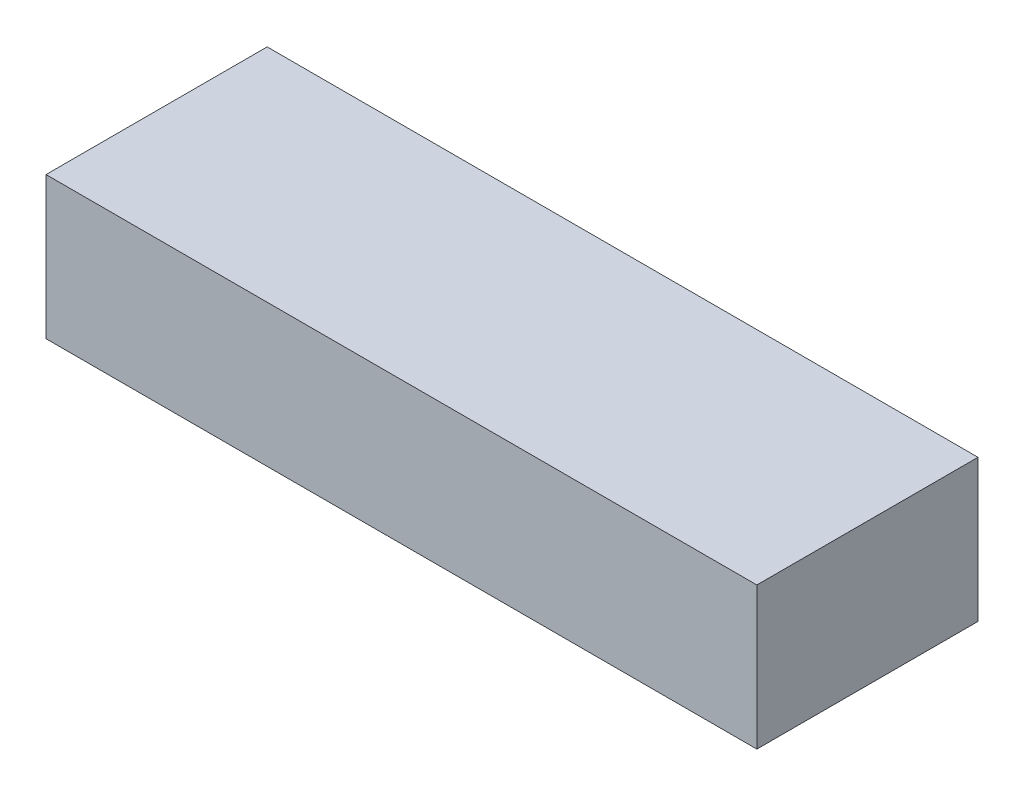
ISO-10303-21;
HEADER;
FILE_DESCRIPTION(('STEP AP214'),'2;1');
FILE_NAME('part.step','',(''),(''),'','','');
FILE_SCHEMA(('AUTOMOTIVE_DESIGN { 1 0 10303 214 1 1 1 1 }'));
ENDSEC;
DATA;
#1=APPLICATION_CONTEXT('core data for automotive mechanical design processes');
#2=APPLICATION_PROTOCOL_DEFINITION('international standard','automotive_design',2000,#1);
#3=PRODUCT_CONTEXT('',#1,'mechanical');
#4=PRODUCT('Part','Part','',(#3));
#5=PRODUCT_RELATED_PRODUCT_CATEGORY('part','',(#4));
#6=PRODUCT_DEFINITION_FORMATION('','',#4);
#7=PRODUCT_DEFINITION_CONTEXT('part definition',#1,'design');
#8=PRODUCT_DEFINITION('design','',#6,#7);
#9=PRODUCT_DEFINITION_SHAPE('','',#8);
#10=(LENGTH_UNIT() NAMED_UNIT(*) SI_UNIT(.MILLI.,.METRE.));
#11=(NAMED_UNIT(*) PLANE_ANGLE_UNIT() SI_UNIT($,.RADIAN.));
#12=(NAMED_UNIT(*) SI_UNIT($,.STERADIAN.) SOLID_ANGLE_UNIT());
#13=UNCERTAINTY_MEASURE_WITH_UNIT(LENGTH_MEASURE(1.E-05),#10,'distance_accuracy_value','');
#14=(GEOMETRIC_REPRESENTATION_CONTEXT(3) GLOBAL_UNCERTAINTY_ASSIGNED_CONTEXT((#13)) GLOBAL_UNIT_ASSIGNED_CONTEXT((#10,
#11,#12)) REPRESENTATION_CONTEXT('',''));
#15=CARTESIAN_POINT('',(0.,0.,0.));
#16=DIRECTION('',(0.,0.,1.));
#17=DIRECTION('',(1.,0.,0.));
#18=AXIS2_PLACEMENT_3D('',#15,#16,#17);
#19=CARTESIAN_POINT('',(0.,27.,0.));
#20=DIRECTION('',(1.,0.,0.));
#21=DIRECTION('',(0.,0.,-1.));
#22=AXIS2_PLACEMENT_3D('',#19,#20,#21);
#23=PLANE('',#22);
#24=DIRECTION('',(0.,0.,1.));
#25=VECTOR('',#24,1.);
#26=CARTESIAN_POINT('',(0.,0.,0.));
#27=LINE('',#26,#25);
#28=CARTESIAN_POINT('',(0.,0.,-42.));
#29=VERTEX_POINT('',#28);
#30=CARTESIAN_POINT('',(0.,0.,0.));
#31=VERTEX_POINT('',#30);
#32=EDGE_CURVE('E103',#29,#31,#27,.T.);
#33=ORIENTED_EDGE('',*,*,#32,.T.);
#34=DIRECTION('',(0.,-1.,0.));
#35=VECTOR('',#34,1.);
#36=CARTESIAN_POINT('',(0.,27.,0.));
#37=LINE('',#36,#35);
#38=CARTESIAN_POINT('',(0.,27.,0.));
#39=VERTEX_POINT('',#38);
#40=EDGE_CURVE('E11',#39,#31,#37,.T.);
#41=ORIENTED_EDGE('',*,*,#40,.F.);
#42=DIRECTION('',(0.,0.,1.));
#43=VECTOR('',#42,1.);
#44=CARTESIAN_POINT('',(0.,27.,0.));
#45=LINE('',#44,#43);
#46=CARTESIAN_POINT('',(0.,27.,-42.));
#47=VERTEX_POINT('',#46);
#48=EDGE_CURVE('E91',#47,#39,#45,.T.);
#49=ORIENTED_EDGE('',*,*,#48,.F.);
#50=DIRECTION('',(0.,-1.,0.));
#51=VECTOR('',#50,1.);
#52=CARTESIAN_POINT('',(0.,27.,-42.));
#53=LINE('',#52,#51);
#54=EDGE_CURVE('E99',#47,#29,#53,.T.);
#55=ORIENTED_EDGE('',*,*,#54,.T.);
#56=EDGE_LOOP('',(#33,#41,#49,#55));
#57=FACE_BOUND('',#56,.T.);
#58=ADVANCED_FACE('F40',(#57),#23,.F.);
#59=CARTESIAN_POINT('',(0.,27.,0.));
#60=DIRECTION('',(0.,0.,-1.));
#61=DIRECTION('',(-1.,0.,0.));
#62=AXIS2_PLACEMENT_3D('',#59,#60,#61);
#63=PLANE('',#62);
#64=DIRECTION('',(1.,0.,0.));
#65=VECTOR('',#64,1.);
#66=CARTESIAN_POINT('',(0.,0.,0.));
#67=LINE('',#66,#65);
#68=CARTESIAN_POINT('',(135.,0.,0.));
#69=VERTEX_POINT('',#68);
#70=EDGE_CURVE('E95',#31,#69,#67,.T.);
#71=ORIENTED_EDGE('',*,*,#70,.T.);
#72=DIRECTION('',(0.,-1.,0.));
#73=VECTOR('',#72,1.);
#74=CARTESIAN_POINT('',(135.,27.,0.));
#75=LINE('',#74,#73);
#76=CARTESIAN_POINT('',(135.,27.,0.));
#77=VERTEX_POINT('',#76);
#78=EDGE_CURVE('E48',#77,#69,#75,.T.);
#79=ORIENTED_EDGE('',*,*,#78,.F.);
#80=DIRECTION('',(1.,0.,0.));
#81=VECTOR('',#80,1.);
#82=CARTESIAN_POINT('',(0.,27.,0.));
#83=LINE('',#82,#81);
#84=EDGE_CURVE('E86',#39,#77,#83,.T.);
#85=ORIENTED_EDGE('',*,*,#84,.F.);
#86=ORIENTED_EDGE('',*,*,#40,.T.);
#87=EDGE_LOOP('',(#71,#79,#85,#86));
#88=FACE_BOUND('',#87,.T.);
#89=ADVANCED_FACE('F94',(#88),#63,.F.);
#90=CARTESIAN_POINT('',(135.,27.,0.));
#91=DIRECTION('',(-1.,0.,0.));
#92=DIRECTION('',(0.,0.,1.));
#93=AXIS2_PLACEMENT_3D('',#90,#91,#92);
#94=PLANE('',#93);
#95=DIRECTION('',(0.,0.,-1.));
#96=VECTOR('',#95,1.);
#97=CARTESIAN_POINT('',(135.,0.,0.));
#98=LINE('',#97,#96);
#99=CARTESIAN_POINT('',(135.,0.,-42.));
#100=VERTEX_POINT('',#99);
#101=EDGE_CURVE('E73',#69,#100,#98,.T.);
#102=ORIENTED_EDGE('',*,*,#101,.T.);
#103=DIRECTION('',(0.,-1.,0.));
#104=VECTOR('',#103,1.);
#105=CARTESIAN_POINT('',(135.,27.,-42.));
#106=LINE('',#105,#104);
#107=CARTESIAN_POINT('',(135.,27.,-42.));
#108=VERTEX_POINT('',#107);
#109=EDGE_CURVE('E96',#108,#100,#106,.T.);
#110=ORIENTED_EDGE('',*,*,#109,.F.);
#111=DIRECTION('',(0.,0.,-1.));
#112=VECTOR('',#111,1.);
#113=CARTESIAN_POINT('',(135.,27.,0.));
#114=LINE('',#113,#112);
#115=EDGE_CURVE('E89',#77,#108,#114,.T.);
#116=ORIENTED_EDGE('',*,*,#115,.F.);
#117=ORIENTED_EDGE('',*,*,#78,.T.);
#118=EDGE_LOOP('',(#102,#110,#116,#117));
#119=FACE_BOUND('',#118,.T.);
#120=ADVANCED_FACE('F97',(#119),#94,.F.);
#121=CARTESIAN_POINT('',(0.,27.,-42.));
#122=DIRECTION('',(0.,0.,1.));
#123=DIRECTION('',(1.,0.,0.));
#124=AXIS2_PLACEMENT_3D('',#121,#122,#123);
#125=PLANE('',#124);
#126=DIRECTION('',(-1.,0.,0.));
#127=VECTOR('',#126,1.);
#128=CARTESIAN_POINT('',(0.,0.,-42.));
#129=LINE('',#128,#127);
#130=EDGE_CURVE('E79',#100,#29,#129,.T.);
#131=ORIENTED_EDGE('',*,*,#130,.T.);
#132=ORIENTED_EDGE('',*,*,#54,.F.);
#133=DIRECTION('',(-1.,0.,0.));
#134=VECTOR('',#133,1.);
#135=CARTESIAN_POINT('',(0.,27.,-42.));
#136=LINE('',#135,#134);
#137=EDGE_CURVE('E56',#108,#47,#136,.T.);
#138=ORIENTED_EDGE('',*,*,#137,.F.);
#139=ORIENTED_EDGE('',*,*,#109,.T.);
#140=EDGE_LOOP('',(#131,#132,#138,#139));
#141=FACE_BOUND('',#140,.T.);
#142=ADVANCED_FACE('F110',(#141),#125,.F.);
#143=CARTESIAN_POINT('',(0.,27.,0.));
#144=DIRECTION('',(0.,-1.,0.));
#145=DIRECTION('',(0.,0.,-1.));
#146=AXIS2_PLACEMENT_3D('',#143,#144,#145);
#147=PLANE('',#146);
#148=ORIENTED_EDGE('',*,*,#48,.T.);
#149=ORIENTED_EDGE('',*,*,#84,.T.);
#150=ORIENTED_EDGE('',*,*,#115,.T.);
#151=ORIENTED_EDGE('',*,*,#137,.T.);
#152=EDGE_LOOP('',(#148,#149,#150,#151));
#153=FACE_BOUND('',#152,.T.);
#154=ADVANCED_FACE('F87',(#153),#147,.F.);
#155=CARTESIAN_POINT('',(0.,0.,0.));
#156=DIRECTION('',(0.,-1.,0.));
#157=DIRECTION('',(0.,0.,-1.));
#158=AXIS2_PLACEMENT_3D('',#155,#156,#157);
#159=PLANE('',#158);
#160=ORIENTED_EDGE('',*,*,#32,.F.);
#161=ORIENTED_EDGE('',*,*,#130,.F.);
#162=ORIENTED_EDGE('',*,*,#101,.F.);
#163=ORIENTED_EDGE('',*,*,#70,.F.);
#164=EDGE_LOOP('',(#160,#161,#162,#163));
#165=FACE_BOUND('',#164,.T.);
#166=ADVANCED_FACE('F113',(#165),#159,.T.);
#167=CLOSED_SHELL('',(#58,#89,#120,#142,#154,#166));
#168=MANIFOLD_SOLID_BREP('B2',#167);
#169=ADVANCED_BREP_SHAPE_REPRESENTATION('',(#18,#168),#14);
#170=SHAPE_DEFINITION_REPRESENTATION(#9,#169);
ENDSEC;
END-ISO-10303-21;
